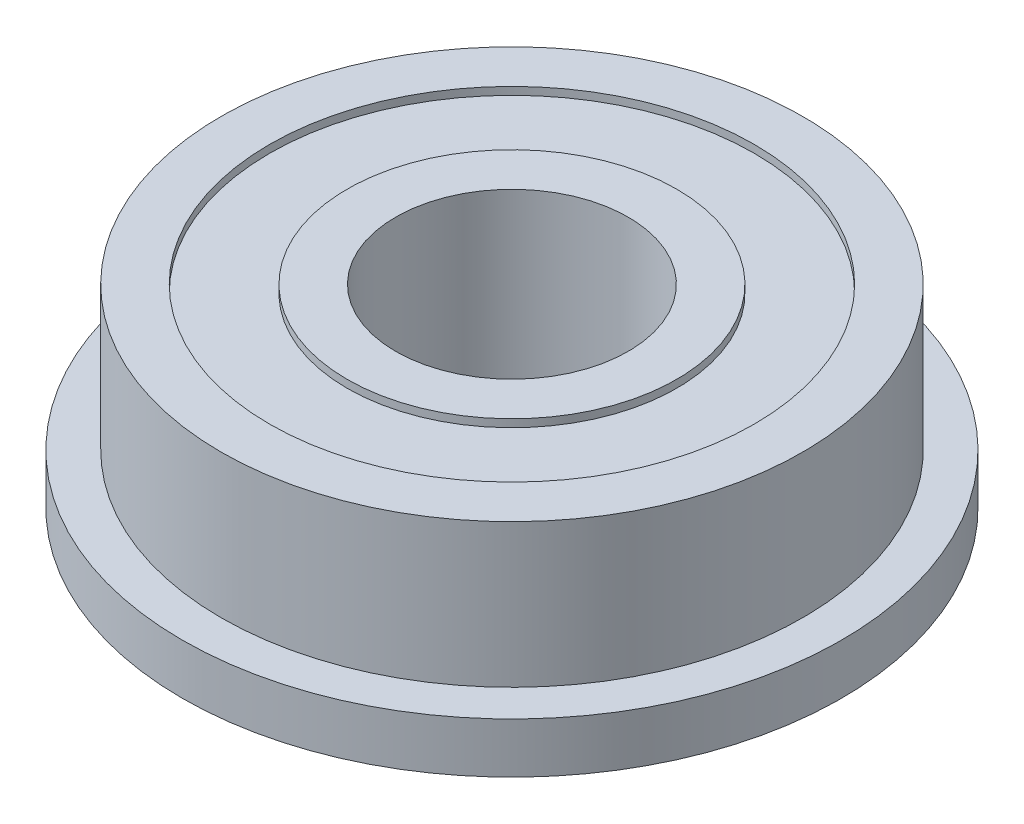
ISO-10303-21;
HEADER;
FILE_DESCRIPTION(('STEP AP214'),'2;1');
FILE_NAME('part.step','',(''),(''),'','','');
FILE_SCHEMA(('AUTOMOTIVE_DESIGN { 1 0 10303 214 1 1 1 1 }'));
ENDSEC;
DATA;
#1=APPLICATION_CONTEXT('core data for automotive mechanical design processes');
#2=APPLICATION_PROTOCOL_DEFINITION('international standard','automotive_design',2000,#1);
#3=PRODUCT_CONTEXT('',#1,'mechanical');
#4=PRODUCT('Part','Part','',(#3));
#5=PRODUCT_RELATED_PRODUCT_CATEGORY('part','',(#4));
#6=PRODUCT_DEFINITION_FORMATION('','',#4);
#7=PRODUCT_DEFINITION_CONTEXT('part definition',#1,'design');
#8=PRODUCT_DEFINITION('design','',#6,#7);
#9=PRODUCT_DEFINITION_SHAPE('','',#8);
#10=(LENGTH_UNIT() NAMED_UNIT(*) SI_UNIT(.MILLI.,.METRE.));
#11=(NAMED_UNIT(*) PLANE_ANGLE_UNIT() SI_UNIT($,.RADIAN.));
#12=(NAMED_UNIT(*) SI_UNIT($,.STERADIAN.) SOLID_ANGLE_UNIT());
#13=UNCERTAINTY_MEASURE_WITH_UNIT(LENGTH_MEASURE(1.E-05),#10,'distance_accuracy_value','');
#14=(GEOMETRIC_REPRESENTATION_CONTEXT(3) GLOBAL_UNCERTAINTY_ASSIGNED_CONTEXT((#13)) GLOBAL_UNIT_ASSIGNED_CONTEXT((#10,
#11,#12)) REPRESENTATION_CONTEXT('',''));
#15=CARTESIAN_POINT('',(0.,0.,0.));
#16=DIRECTION('',(0.,0.,1.));
#17=DIRECTION('',(1.,0.,0.));
#18=AXIS2_PLACEMENT_3D('',#15,#16,#17);
#19=CARTESIAN_POINT('',(0.,0.,0.));
#20=DIRECTION('',(0.,1.,0.));
#21=DIRECTION('',(0.,0.,1.));
#22=AXIS2_PLACEMENT_3D('',#19,#20,#21);
#23=PLANE('',#22);
#24=CARTESIAN_POINT('',(0.,0.,0.));
#25=DIRECTION('',(0.,1.,0.));
#26=DIRECTION('',(0.,0.,1.));
#27=AXIS2_PLACEMENT_3D('',#24,#25,#26);
#28=CIRCLE('',#27,3.);
#29=CARTESIAN_POINT('',(0.,0.,3.));
#30=VERTEX_POINT('',#29);
#31=EDGE_CURVE('E50',#30,#30,#28,.F.);
#32=ORIENTED_EDGE('',*,*,#31,.F.);
#33=EDGE_LOOP('',(#32));
#34=FACE_BOUND('',#33,.T.);
#35=CARTESIAN_POINT('',(0.,0.,0.));
#36=DIRECTION('',(0.,-1.,0.));
#37=DIRECTION('',(0.,0.,-1.));
#38=AXIS2_PLACEMENT_3D('',#35,#36,#37);
#39=CIRCLE('',#38,4.25);
#40=CARTESIAN_POINT('',(0.,0.,-4.25));
#41=VERTEX_POINT('',#40);
#42=EDGE_CURVE('E84',#41,#41,#39,.T.);
#43=ORIENTED_EDGE('',*,*,#42,.T.);
#44=EDGE_LOOP('',(#43));
#45=FACE_BOUND('',#44,.T.);
#46=ADVANCED_FACE('F35',(#34,#45),#23,.F.);
#47=CARTESIAN_POINT('',(0.,5.,0.));
#48=DIRECTION('',(0.,1.,0.));
#49=DIRECTION('',(0.,0.,1.));
#50=AXIS2_PLACEMENT_3D('',#47,#48,#49);
#51=PLANE('',#50);
#52=CARTESIAN_POINT('',(0.,5.,0.));
#53=DIRECTION('',(0.,1.,0.));
#54=DIRECTION('',(0.,0.,1.));
#55=AXIS2_PLACEMENT_3D('',#52,#53,#54);
#56=CIRCLE('',#55,3.);
#57=CARTESIAN_POINT('',(0.,5.,3.));
#58=VERTEX_POINT('',#57);
#59=EDGE_CURVE('E58',#58,#58,#56,.T.);
#60=ORIENTED_EDGE('',*,*,#59,.F.);
#61=EDGE_LOOP('',(#60));
#62=FACE_BOUND('',#61,.T.);
#63=CARTESIAN_POINT('',(0.,5.,0.));
#64=DIRECTION('',(0.,1.,0.));
#65=DIRECTION('',(0.,0.,1.));
#66=AXIS2_PLACEMENT_3D('',#63,#64,#65);
#67=CIRCLE('',#66,4.25);
#68=CARTESIAN_POINT('',(0.,5.,4.25));
#69=VERTEX_POINT('',#68);
#70=EDGE_CURVE('E72',#69,#69,#67,.T.);
#71=ORIENTED_EDGE('',*,*,#70,.T.);
#72=EDGE_LOOP('',(#71));
#73=FACE_BOUND('',#72,.T.);
#74=ADVANCED_FACE('F114',(#62,#73),#51,.T.);
#75=CARTESIAN_POINT('',(0.,1.3,0.));
#76=DIRECTION('',(0.,-1.,0.));
#77=DIRECTION('',(0.,0.,-1.));
#78=AXIS2_PLACEMENT_3D('',#75,#76,#77);
#79=CYLINDRICAL_SURFACE('',#78,8.5);
#80=CARTESIAN_POINT('',(0.,1.3,0.));
#81=DIRECTION('',(0.,1.,0.));
#82=DIRECTION('',(0.,0.,1.));
#83=AXIS2_PLACEMENT_3D('',#80,#81,#82);
#84=CIRCLE('',#83,8.5);
#85=CARTESIAN_POINT('',(0.,1.3,8.5));
#86=VERTEX_POINT('',#85);
#87=EDGE_CURVE('E43',#86,#86,#84,.T.);
#88=ORIENTED_EDGE('',*,*,#87,.F.);
#89=EDGE_LOOP('',(#88));
#90=FACE_BOUND('',#89,.T.);
#91=CARTESIAN_POINT('',(0.,0.,0.));
#92=DIRECTION('',(0.,1.,0.));
#93=DIRECTION('',(0.,0.,1.));
#94=AXIS2_PLACEMENT_3D('',#91,#92,#93);
#95=CIRCLE('',#94,8.5);
#96=CARTESIAN_POINT('',(0.,0.,8.5));
#97=VERTEX_POINT('',#96);
#98=EDGE_CURVE('E39',#97,#97,#95,.T.);
#99=ORIENTED_EDGE('',*,*,#98,.T.);
#100=EDGE_LOOP('',(#99));
#101=FACE_BOUND('',#100,.T.);
#102=ADVANCED_FACE('F37',(#90,#101),#79,.T.);
#103=CARTESIAN_POINT('',(0.,1.3,0.));
#104=DIRECTION('',(0.,1.,0.));
#105=DIRECTION('',(0.,0.,1.));
#106=AXIS2_PLACEMENT_3D('',#103,#104,#105);
#107=PLANE('',#106);
#108=CARTESIAN_POINT('',(0.,1.3,0.));
#109=DIRECTION('',(0.,1.,0.));
#110=DIRECTION('',(0.,0.,1.));
#111=AXIS2_PLACEMENT_3D('',#108,#109,#110);
#112=CIRCLE('',#111,7.5);
#113=CARTESIAN_POINT('',(0.,1.3,7.5));
#114=VERTEX_POINT('',#113);
#115=EDGE_CURVE('E11',#114,#114,#112,.T.);
#116=ORIENTED_EDGE('',*,*,#115,.F.);
#117=EDGE_LOOP('',(#116));
#118=FACE_BOUND('',#117,.T.);
#119=ORIENTED_EDGE('',*,*,#87,.T.);
#120=EDGE_LOOP('',(#119));
#121=FACE_BOUND('',#120,.T.);
#122=ADVANCED_FACE('F110',(#118,#121),#107,.T.);
#123=CARTESIAN_POINT('',(0.,0.,0.));
#124=DIRECTION('',(0.,-1.,0.));
#125=DIRECTION('',(0.,0.,-1.));
#126=AXIS2_PLACEMENT_3D('',#123,#124,#125);
#127=CIRCLE('',#126,6.25);
#128=CARTESIAN_POINT('',(0.,0.,-6.25));
#129=VERTEX_POINT('',#128);
#130=EDGE_CURVE('E78',#129,#129,#127,.T.);
#131=ORIENTED_EDGE('',*,*,#130,.F.);
#132=EDGE_LOOP('',(#131));
#133=FACE_BOUND('',#132,.T.);
#134=ORIENTED_EDGE('',*,*,#98,.F.);
#135=EDGE_LOOP('',(#134));
#136=FACE_BOUND('',#135,.T.);
#137=ADVANCED_FACE('F106',(#133,#136),#23,.F.);
#138=CARTESIAN_POINT('',(0.,31.2132034355964,0.));
#139=DIRECTION('',(0.,-1.,0.));
#140=DIRECTION('',(0.,0.,-1.));
#141=AXIS2_PLACEMENT_3D('',#138,#139,#140);
#142=CYLINDRICAL_SURFACE('',#141,7.5);
#143=ORIENTED_EDGE('',*,*,#115,.T.);
#144=EDGE_LOOP('',(#143));
#145=FACE_BOUND('',#144,.T.);
#146=CARTESIAN_POINT('',(0.,5.,0.));
#147=DIRECTION('',(0.,1.,0.));
#148=DIRECTION('',(0.,0.,1.));
#149=AXIS2_PLACEMENT_3D('',#146,#147,#148);
#150=CIRCLE('',#149,7.5);
#151=CARTESIAN_POINT('',(0.,5.,7.5));
#152=VERTEX_POINT('',#151);
#153=EDGE_CURVE('E52',#152,#152,#150,.T.);
#154=ORIENTED_EDGE('',*,*,#153,.F.);
#155=EDGE_LOOP('',(#154));
#156=FACE_BOUND('',#155,.T.);
#157=ADVANCED_FACE('F109',(#145,#156),#142,.T.);
#158=CARTESIAN_POINT('',(0.,5.,0.));
#159=DIRECTION('',(0.,1.,0.));
#160=DIRECTION('',(0.,0.,1.));
#161=AXIS2_PLACEMENT_3D('',#158,#159,#160);
#162=CIRCLE('',#161,6.25);
#163=CARTESIAN_POINT('',(0.,5.,6.25));
#164=VERTEX_POINT('',#163);
#165=EDGE_CURVE('E66',#164,#164,#162,.T.);
#166=ORIENTED_EDGE('',*,*,#165,.F.);
#167=EDGE_LOOP('',(#166));
#168=FACE_BOUND('',#167,.T.);
#169=ORIENTED_EDGE('',*,*,#153,.T.);
#170=EDGE_LOOP('',(#169));
#171=FACE_BOUND('',#170,.T.);
#172=ADVANCED_FACE('F124',(#168,#171),#51,.T.);
#173=CARTESIAN_POINT('',(0.,-0.00100000000000013,0.));
#174=DIRECTION('',(0.,1.,0.));
#175=DIRECTION('',(0.,0.,1.));
#176=AXIS2_PLACEMENT_3D('',#173,#174,#175);
#177=CYLINDRICAL_SURFACE('',#176,3.);
#178=ORIENTED_EDGE('',*,*,#59,.T.);
#179=EDGE_LOOP('',(#178));
#180=FACE_BOUND('',#179,.T.);
#181=ORIENTED_EDGE('',*,*,#31,.T.);
#182=EDGE_LOOP('',(#181));
#183=FACE_BOUND('',#182,.T.);
#184=ADVANCED_FACE('F133',(#180,#183),#177,.F.);
#185=CARTESIAN_POINT('',(0.,4.8,0.));
#186=DIRECTION('',(0.,1.,0.));
#187=DIRECTION('',(0.,0.,1.));
#188=AXIS2_PLACEMENT_3D('',#185,#186,#187);
#189=CYLINDRICAL_SURFACE('',#188,6.25);
#190=CARTESIAN_POINT('',(0.,4.8,0.));
#191=DIRECTION('',(0.,1.,0.));
#192=DIRECTION('',(0.,0.,1.));
#193=AXIS2_PLACEMENT_3D('',#190,#191,#192);
#194=CIRCLE('',#193,6.25);
#195=CARTESIAN_POINT('',(0.,4.8,6.25));
#196=VERTEX_POINT('',#195);
#197=EDGE_CURVE('E62',#196,#196,#194,.T.);
#198=ORIENTED_EDGE('',*,*,#197,.F.);
#199=EDGE_LOOP('',(#198));
#200=FACE_BOUND('',#199,.T.);
#201=ORIENTED_EDGE('',*,*,#165,.T.);
#202=EDGE_LOOP('',(#201));
#203=FACE_BOUND('',#202,.T.);
#204=ADVANCED_FACE('F139',(#200,#203),#189,.F.);
#205=CARTESIAN_POINT('',(0.,4.8,0.));
#206=DIRECTION('',(0.,1.,0.));
#207=DIRECTION('',(0.,0.,1.));
#208=AXIS2_PLACEMENT_3D('',#205,#206,#207);
#209=PLANE('',#208);
#210=CARTESIAN_POINT('',(0.,4.8,0.));
#211=DIRECTION('',(0.,1.,0.));
#212=DIRECTION('',(0.,0.,1.));
#213=AXIS2_PLACEMENT_3D('',#210,#211,#212);
#214=CIRCLE('',#213,4.25);
#215=CARTESIAN_POINT('',(0.,4.8,4.25));
#216=VERTEX_POINT('',#215);
#217=EDGE_CURVE('E70',#216,#216,#214,.T.);
#218=ORIENTED_EDGE('',*,*,#217,.F.);
#219=EDGE_LOOP('',(#218));
#220=FACE_BOUND('',#219,.T.);
#221=ORIENTED_EDGE('',*,*,#197,.T.);
#222=EDGE_LOOP('',(#221));
#223=FACE_BOUND('',#222,.T.);
#224=ADVANCED_FACE('F142',(#220,#223),#209,.T.);
#225=CARTESIAN_POINT('',(0.,4.8,0.));
#226=DIRECTION('',(0.,1.,0.));
#227=DIRECTION('',(0.,0.,1.));
#228=AXIS2_PLACEMENT_3D('',#225,#226,#227);
#229=CYLINDRICAL_SURFACE('',#228,4.25);
#230=ORIENTED_EDGE('',*,*,#217,.T.);
#231=EDGE_LOOP('',(#230));
#232=FACE_BOUND('',#231,.T.);
#233=ORIENTED_EDGE('',*,*,#70,.F.);
#234=EDGE_LOOP('',(#233));
#235=FACE_BOUND('',#234,.T.);
#236=ADVANCED_FACE('F102',(#232,#235),#229,.T.);
#237=CARTESIAN_POINT('',(0.,0.2,0.));
#238=DIRECTION('',(0.,-1.,0.));
#239=DIRECTION('',(0.,0.,-1.));
#240=AXIS2_PLACEMENT_3D('',#237,#238,#239);
#241=CYLINDRICAL_SURFACE('',#240,6.25);
#242=CARTESIAN_POINT('',(0.,0.2,0.));
#243=DIRECTION('',(0.,-1.,0.));
#244=DIRECTION('',(0.,0.,-1.));
#245=AXIS2_PLACEMENT_3D('',#242,#243,#244);
#246=CIRCLE('',#245,6.25);
#247=CARTESIAN_POINT('',(0.,0.2,-6.25));
#248=VERTEX_POINT('',#247);
#249=EDGE_CURVE('E75',#248,#248,#246,.T.);
#250=ORIENTED_EDGE('',*,*,#249,.F.);
#251=EDGE_LOOP('',(#250));
#252=FACE_BOUND('',#251,.T.);
#253=ORIENTED_EDGE('',*,*,#130,.T.);
#254=EDGE_LOOP('',(#253));
#255=FACE_BOUND('',#254,.T.);
#256=ADVANCED_FACE('F96',(#252,#255),#241,.F.);
#257=CARTESIAN_POINT('',(0.,0.2,0.));
#258=DIRECTION('',(0.,-1.,0.));
#259=DIRECTION('',(0.,0.,-1.));
#260=AXIS2_PLACEMENT_3D('',#257,#258,#259);
#261=PLANE('',#260);
#262=CARTESIAN_POINT('',(0.,0.2,0.));
#263=DIRECTION('',(0.,-1.,0.));
#264=DIRECTION('',(0.,0.,-1.));
#265=AXIS2_PLACEMENT_3D('',#262,#263,#264);
#266=CIRCLE('',#265,4.25);
#267=CARTESIAN_POINT('',(0.,0.2,-4.25));
#268=VERTEX_POINT('',#267);
#269=EDGE_CURVE('E81',#268,#268,#266,.T.);
#270=ORIENTED_EDGE('',*,*,#269,.F.);
#271=EDGE_LOOP('',(#270));
#272=FACE_BOUND('',#271,.T.);
#273=ORIENTED_EDGE('',*,*,#249,.T.);
#274=EDGE_LOOP('',(#273));
#275=FACE_BOUND('',#274,.T.);
#276=ADVANCED_FACE('F93',(#272,#275),#261,.T.);
#277=CARTESIAN_POINT('',(0.,0.2,0.));
#278=DIRECTION('',(0.,-1.,0.));
#279=DIRECTION('',(0.,0.,-1.));
#280=AXIS2_PLACEMENT_3D('',#277,#278,#279);
#281=CYLINDRICAL_SURFACE('',#280,4.25);
#282=ORIENTED_EDGE('',*,*,#269,.T.);
#283=EDGE_LOOP('',(#282));
#284=FACE_BOUND('',#283,.T.);
#285=ORIENTED_EDGE('',*,*,#42,.F.);
#286=EDGE_LOOP('',(#285));
#287=FACE_BOUND('',#286,.T.);
#288=ADVANCED_FACE('F90',(#284,#287),#281,.T.);
#289=CLOSED_SHELL('',(#46,#74,#102,#122,#137,#157,#172,#184,#204,#224,#236,#256,#276,#288));
#290=MANIFOLD_SOLID_BREP('B2',#289);
#291=ADVANCED_BREP_SHAPE_REPRESENTATION('',(#18,#290),#14);
#292=SHAPE_DEFINITION_REPRESENTATION(#9,#291);
ENDSEC;
END-ISO-10303-21;
